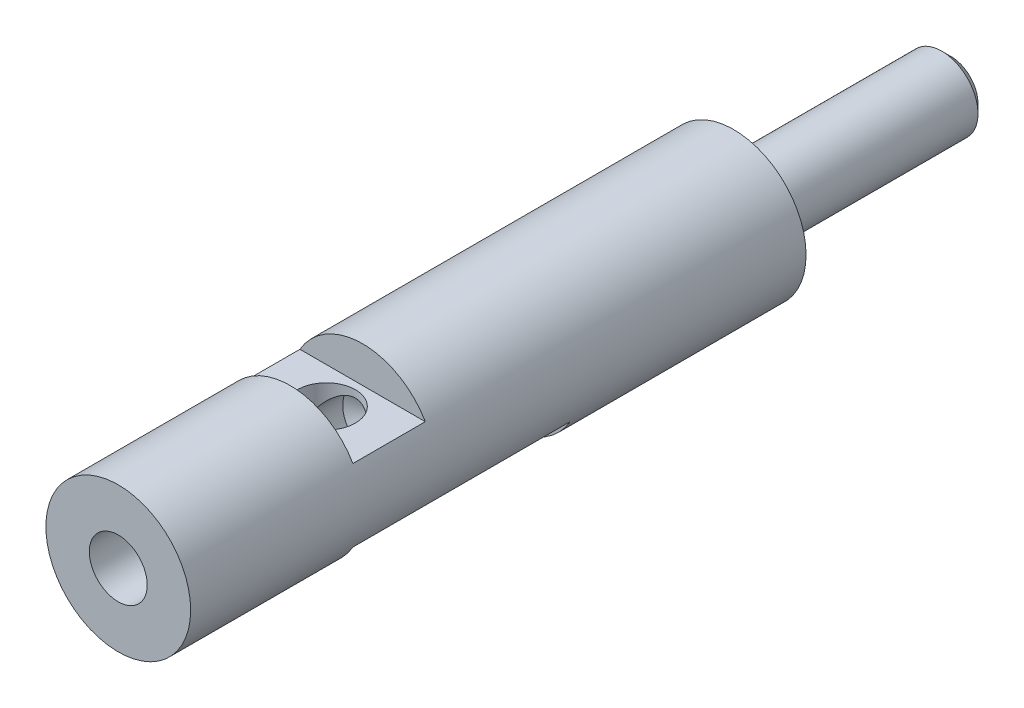
ISO-10303-21;
HEADER;
FILE_DESCRIPTION(('STEP AP214'),'2;1');
FILE_NAME('part.step','',(''),(''),'','','');
FILE_SCHEMA(('AUTOMOTIVE_DESIGN { 1 0 10303 214 1 1 1 1 }'));
ENDSEC;
DATA;
#1=APPLICATION_CONTEXT('core data for automotive mechanical design processes');
#2=APPLICATION_PROTOCOL_DEFINITION('international standard','automotive_design',2000,#1);
#3=PRODUCT_CONTEXT('',#1,'mechanical');
#4=PRODUCT('Part','Part','',(#3));
#5=PRODUCT_RELATED_PRODUCT_CATEGORY('part','',(#4));
#6=PRODUCT_DEFINITION_FORMATION('','',#4);
#7=PRODUCT_DEFINITION_CONTEXT('part definition',#1,'design');
#8=PRODUCT_DEFINITION('design','',#6,#7);
#9=PRODUCT_DEFINITION_SHAPE('','',#8);
#10=(LENGTH_UNIT() NAMED_UNIT(*) SI_UNIT(.MILLI.,.METRE.));
#11=(NAMED_UNIT(*) PLANE_ANGLE_UNIT() SI_UNIT($,.RADIAN.));
#12=(NAMED_UNIT(*) SI_UNIT($,.STERADIAN.) SOLID_ANGLE_UNIT());
#13=UNCERTAINTY_MEASURE_WITH_UNIT(LENGTH_MEASURE(1.E-05),#10,'distance_accuracy_value','');
#14=(GEOMETRIC_REPRESENTATION_CONTEXT(3) GLOBAL_UNCERTAINTY_ASSIGNED_CONTEXT((#13)) GLOBAL_UNIT_ASSIGNED_CONTEXT((#10,
#11,#12)) REPRESENTATION_CONTEXT('',''));
#15=CARTESIAN_POINT('',(0.,0.,0.));
#16=DIRECTION('',(0.,0.,1.));
#17=DIRECTION('',(1.,0.,0.));
#18=AXIS2_PLACEMENT_3D('',#15,#16,#17);
#19=CARTESIAN_POINT('',(-4.,2.,24.5));
#20=DIRECTION('',(0.,-1.,0.));
#21=DIRECTION('',(0.,0.,-1.));
#22=AXIS2_PLACEMENT_3D('',#19,#20,#21);
#23=PLANE('',#22);
#24=DIRECTION('',(1.,0.,0.));
#25=VECTOR('',#24,1.);
#26=CARTESIAN_POINT('',(-4.,2.,24.5));
#27=LINE('',#26,#25);
#28=CARTESIAN_POINT('',(-3.46410161513775,2.,24.5));
#29=VERTEX_POINT('',#28);
#30=CARTESIAN_POINT('',(3.46410161513775,2.,24.5));
#31=VERTEX_POINT('',#30);
#32=EDGE_CURVE('E61',#29,#31,#27,.T.);
#33=ORIENTED_EDGE('',*,*,#32,.T.);
#34=DIRECTION('',(0.,0.,-1.));
#35=VECTOR('',#34,1.);
#36=CARTESIAN_POINT('',(3.46410161513776,2.,34.));
#37=LINE('',#36,#35);
#38=CARTESIAN_POINT('',(3.46410161513776,2.,20.5));
#39=VERTEX_POINT('',#38);
#40=EDGE_CURVE('E148',#39,#31,#37,.F.);
#41=ORIENTED_EDGE('',*,*,#40,.F.);
#42=DIRECTION('',(1.,0.,0.));
#43=VECTOR('',#42,1.);
#44=CARTESIAN_POINT('',(-4.,2.,20.5));
#45=LINE('',#44,#43);
#46=CARTESIAN_POINT('',(-3.46410161513776,2.,20.5));
#47=VERTEX_POINT('',#46);
#48=EDGE_CURVE('E105',#47,#39,#45,.T.);
#49=ORIENTED_EDGE('',*,*,#48,.F.);
#50=DIRECTION('',(0.,0.,-1.));
#51=VECTOR('',#50,1.);
#52=CARTESIAN_POINT('',(-3.46410161513776,2.,34.));
#53=LINE('',#52,#51);
#54=EDGE_CURVE('E151',#29,#47,#53,.T.);
#55=ORIENTED_EDGE('',*,*,#54,.F.);
#56=EDGE_LOOP('',(#33,#41,#49,#55));
#57=FACE_BOUND('',#56,.T.);
#58=CARTESIAN_POINT('',(0.,2.,22.5));
#59=DIRECTION('',(0.,1.,0.));
#60=DIRECTION('',(0.,0.,1.));
#61=AXIS2_PLACEMENT_3D('',#58,#59,#60);
#62=CIRCLE('',#61,1.6);
#63=CARTESIAN_POINT('',(0.,2.,24.1));
#64=VERTEX_POINT('',#63);
#65=EDGE_CURVE('E162',#64,#64,#62,.T.);
#66=ORIENTED_EDGE('',*,*,#65,.F.);
#67=EDGE_LOOP('',(#66));
#68=FACE_BOUND('',#67,.T.);
#69=ADVANCED_FACE('F41',(#57,#68),#23,.F.);
#70=CARTESIAN_POINT('',(0.,0.,34.));
#71=DIRECTION('',(0.,0.,-1.));
#72=DIRECTION('',(-1.,0.,0.));
#73=AXIS2_PLACEMENT_3D('',#70,#71,#72);
#74=CYLINDRICAL_SURFACE('',#73,4.);
#75=ORIENTED_EDGE('',*,*,#54,.T.);
#76=CARTESIAN_POINT('',(0.,0.,20.5));
#77=DIRECTION('',(0.,0.,-1.));
#78=DIRECTION('',(-1.,0.,0.));
#79=AXIS2_PLACEMENT_3D('',#76,#77,#78);
#80=CIRCLE('',#79,4.);
#81=EDGE_CURVE('E90',#47,#39,#80,.T.);
#82=ORIENTED_EDGE('',*,*,#81,.T.);
#83=ORIENTED_EDGE('',*,*,#40,.T.);
#84=CARTESIAN_POINT('',(0.,0.,24.5));
#85=DIRECTION('',(0.,0.,1.));
#86=DIRECTION('',(1.,0.,0.));
#87=AXIS2_PLACEMENT_3D('',#84,#85,#86);
#88=CIRCLE('',#87,4.);
#89=EDGE_CURVE('E145',#31,#29,#88,.T.);
#90=ORIENTED_EDGE('',*,*,#89,.T.);
#91=EDGE_LOOP('',(#75,#82,#83,#90));
#92=FACE_BOUND('',#91,.T.);
#93=DIRECTION('',(0.,0.,-1.));
#94=VECTOR('',#93,1.);
#95=CARTESIAN_POINT('',(-3.46410161513775,-2.,34.));
#96=LINE('',#95,#94);
#97=CARTESIAN_POINT('',(-3.46410161513775,-2.,12.5));
#98=VERTEX_POINT('',#97);
#99=CARTESIAN_POINT('',(-3.46410161513775,-2.,24.5));
#100=VERTEX_POINT('',#99);
#101=EDGE_CURVE('E136',#98,#100,#96,.F.);
#102=ORIENTED_EDGE('',*,*,#101,.T.);
#103=CARTESIAN_POINT('',(0.,0.,24.5));
#104=DIRECTION('',(0.,0.,1.));
#105=DIRECTION('',(1.,0.,0.));
#106=AXIS2_PLACEMENT_3D('',#103,#104,#105);
#107=CIRCLE('',#106,4.);
#108=CARTESIAN_POINT('',(3.46410161513775,-2.,24.5));
#109=VERTEX_POINT('',#108);
#110=EDGE_CURVE('E142',#100,#109,#107,.T.);
#111=ORIENTED_EDGE('',*,*,#110,.T.);
#112=DIRECTION('',(0.,0.,-1.));
#113=VECTOR('',#112,1.);
#114=CARTESIAN_POINT('',(3.46410161513775,-2.,34.));
#115=LINE('',#114,#113);
#116=CARTESIAN_POINT('',(3.46410161513775,-2.,12.5));
#117=VERTEX_POINT('',#116);
#118=EDGE_CURVE('E139',#109,#117,#115,.T.);
#119=ORIENTED_EDGE('',*,*,#118,.T.);
#120=CARTESIAN_POINT('',(0.,0.,12.5));
#121=DIRECTION('',(0.,0.,-1.));
#122=DIRECTION('',(-1.,0.,0.));
#123=AXIS2_PLACEMENT_3D('',#120,#121,#122);
#124=CIRCLE('',#123,4.);
#125=EDGE_CURVE('E133',#117,#98,#124,.T.);
#126=ORIENTED_EDGE('',*,*,#125,.T.);
#127=EDGE_LOOP('',(#102,#111,#119,#126));
#128=FACE_BOUND('',#127,.T.);
#129=CARTESIAN_POINT('',(0.,0.,34.));
#130=DIRECTION('',(0.,0.,1.));
#131=DIRECTION('',(1.,0.,0.));
#132=AXIS2_PLACEMENT_3D('',#129,#130,#131);
#133=CIRCLE('',#132,4.);
#134=CARTESIAN_POINT('',(4.,0.,34.));
#135=VERTEX_POINT('',#134);
#136=EDGE_CURVE('E123',#135,#135,#133,.T.);
#137=ORIENTED_EDGE('',*,*,#136,.F.);
#138=EDGE_LOOP('',(#137));
#139=FACE_BOUND('',#138,.T.);
#140=CARTESIAN_POINT('',(0.,0.,0.));
#141=DIRECTION('',(0.,0.,1.));
#142=DIRECTION('',(1.,0.,0.));
#143=AXIS2_PLACEMENT_3D('',#140,#141,#142);
#144=CIRCLE('',#143,4.);
#145=CARTESIAN_POINT('',(4.,0.,0.));
#146=VERTEX_POINT('',#145);
#147=EDGE_CURVE('E116',#146,#146,#144,.T.);
#148=ORIENTED_EDGE('',*,*,#147,.T.);
#149=EDGE_LOOP('',(#148));
#150=FACE_BOUND('',#149,.T.);
#151=ADVANCED_FACE('F156',(#92,#128,#139,#150),#74,.T.);
#152=CARTESIAN_POINT('',(0.,0.,34.));
#153=DIRECTION('',(0.,0.,1.));
#154=DIRECTION('',(1.,0.,0.));
#155=AXIS2_PLACEMENT_3D('',#152,#153,#154);
#156=PLANE('',#155);
#157=CARTESIAN_POINT('',(0.,0.,34.));
#158=DIRECTION('',(0.,0.,1.));
#159=DIRECTION('',(1.,0.,0.));
#160=AXIS2_PLACEMENT_3D('',#157,#158,#159);
#161=CIRCLE('',#160,1.6);
#162=CARTESIAN_POINT('',(1.6,0.,34.));
#163=VERTEX_POINT('',#162);
#164=EDGE_CURVE('E103',#163,#163,#161,.T.);
#165=ORIENTED_EDGE('',*,*,#164,.F.);
#166=EDGE_LOOP('',(#165));
#167=FACE_BOUND('',#166,.T.);
#168=ORIENTED_EDGE('',*,*,#136,.T.);
#169=EDGE_LOOP('',(#168));
#170=FACE_BOUND('',#169,.T.);
#171=ADVANCED_FACE('F172',(#167,#170),#156,.T.);
#172=CARTESIAN_POINT('',(0.,0.,0.));
#173=DIRECTION('',(0.,0.,1.));
#174=DIRECTION('',(1.,0.,0.));
#175=AXIS2_PLACEMENT_3D('',#172,#173,#174);
#176=PLANE('',#175);
#177=CARTESIAN_POINT('',(0.,0.,0.));
#178=DIRECTION('',(0.,0.,-1.));
#179=DIRECTION('',(-1.,0.,0.));
#180=AXIS2_PLACEMENT_3D('',#177,#178,#179);
#181=CIRCLE('',#180,2.);
#182=CARTESIAN_POINT('',(-2.,0.,0.));
#183=VERTEX_POINT('',#182);
#184=EDGE_CURVE('E119',#183,#183,#181,.T.);
#185=ORIENTED_EDGE('',*,*,#184,.F.);
#186=EDGE_LOOP('',(#185));
#187=FACE_BOUND('',#186,.T.);
#188=ORIENTED_EDGE('',*,*,#147,.F.);
#189=EDGE_LOOP('',(#188));
#190=FACE_BOUND('',#189,.T.);
#191=ADVANCED_FACE('F200',(#187,#190),#176,.F.);
#192=CARTESIAN_POINT('',(0.,0.,-12.));
#193=DIRECTION('',(0.,0.,1.));
#194=DIRECTION('',(1.,0.,0.));
#195=AXIS2_PLACEMENT_3D('',#192,#193,#194);
#196=CYLINDRICAL_SURFACE('',#195,2.);
#197=CARTESIAN_POINT('',(0.,0.,-11.5));
#198=DIRECTION('',(0.,0.,-1.));
#199=DIRECTION('',(-1.,0.,0.));
#200=AXIS2_PLACEMENT_3D('',#197,#198,#199);
#201=CIRCLE('',#200,2.);
#202=CARTESIAN_POINT('',(-2.,0.,-11.5));
#203=VERTEX_POINT('',#202);
#204=EDGE_CURVE('E130',#203,#203,#201,.F.);
#205=ORIENTED_EDGE('',*,*,#204,.T.);
#206=EDGE_LOOP('',(#205));
#207=FACE_BOUND('',#206,.T.);
#208=ORIENTED_EDGE('',*,*,#184,.T.);
#209=EDGE_LOOP('',(#208));
#210=FACE_BOUND('',#209,.T.);
#211=ADVANCED_FACE('F196',(#207,#210),#196,.T.);
#212=CARTESIAN_POINT('',(0.,0.,-12.));
#213=DIRECTION('',(0.,0.,-1.));
#214=DIRECTION('',(-1.,0.,0.));
#215=AXIS2_PLACEMENT_3D('',#212,#213,#214);
#216=PLANE('',#215);
#217=CARTESIAN_POINT('',(0.,0.,-12.));
#218=DIRECTION('',(0.,0.,-1.));
#219=DIRECTION('',(-1.,0.,0.));
#220=AXIS2_PLACEMENT_3D('',#217,#218,#219);
#221=CIRCLE('',#220,1.5);
#222=CARTESIAN_POINT('',(-1.5,0.,-12.));
#223=VERTEX_POINT('',#222);
#224=EDGE_CURVE('E122',#223,#223,#221,.T.);
#225=ORIENTED_EDGE('',*,*,#224,.T.);
#226=EDGE_LOOP('',(#225));
#227=FACE_BOUND('',#226,.T.);
#228=ADVANCED_FACE('F193',(#227),#216,.T.);
#229=CARTESIAN_POINT('',(0.,0.,-12.));
#230=DIRECTION('',(0.,0.,1.));
#231=DIRECTION('',(1.,0.,0.));
#232=AXIS2_PLACEMENT_3D('',#229,#230,#231);
#233=CONICAL_SURFACE('',#232,1.5,0.785398163397441);
#234=ORIENTED_EDGE('',*,*,#204,.F.);
#235=EDGE_LOOP('',(#234));
#236=FACE_BOUND('',#235,.T.);
#237=ORIENTED_EDGE('',*,*,#224,.F.);
#238=EDGE_LOOP('',(#237));
#239=FACE_BOUND('',#238,.T.);
#240=ADVANCED_FACE('F44',(#236,#239),#233,.T.);
#241=CARTESIAN_POINT('',(-4.,-4.,24.5));
#242=DIRECTION('',(0.,0.,1.));
#243=DIRECTION('',(1.,0.,0.));
#244=AXIS2_PLACEMENT_3D('',#241,#242,#243);
#245=PLANE('',#244);
#246=DIRECTION('',(1.,0.,0.));
#247=VECTOR('',#246,1.);
#248=CARTESIAN_POINT('',(-4.,-2.,24.5));
#249=LINE('',#248,#247);
#250=EDGE_CURVE('E113',#100,#109,#249,.T.);
#251=ORIENTED_EDGE('',*,*,#250,.T.);
#252=ORIENTED_EDGE('',*,*,#110,.F.);
#253=EDGE_LOOP('',(#251,#252));
#254=FACE_BOUND('',#253,.T.);
#255=ADVANCED_FACE('F182',(#254),#245,.F.);
#256=CARTESIAN_POINT('',(-4.,-2.,24.5));
#257=DIRECTION('',(0.,1.,0.));
#258=DIRECTION('',(0.,0.,1.));
#259=AXIS2_PLACEMENT_3D('',#256,#257,#258);
#260=PLANE('',#259);
#261=ORIENTED_EDGE('',*,*,#250,.F.);
#262=ORIENTED_EDGE('',*,*,#101,.F.);
#263=DIRECTION('',(1.,0.,0.));
#264=VECTOR('',#263,1.);
#265=CARTESIAN_POINT('',(-4.,-2.,12.5));
#266=LINE('',#265,#264);
#267=EDGE_CURVE('E107',#98,#117,#266,.T.);
#268=ORIENTED_EDGE('',*,*,#267,.T.);
#269=ORIENTED_EDGE('',*,*,#118,.F.);
#270=EDGE_LOOP('',(#261,#262,#268,#269));
#271=FACE_BOUND('',#270,.T.);
#272=ADVANCED_FACE('F185',(#271),#260,.F.);
#273=CARTESIAN_POINT('',(-4.,-2.,12.5));
#274=DIRECTION('',(0.,0.,-1.));
#275=DIRECTION('',(-1.,0.,0.));
#276=AXIS2_PLACEMENT_3D('',#273,#274,#275);
#277=PLANE('',#276);
#278=ORIENTED_EDGE('',*,*,#267,.F.);
#279=ORIENTED_EDGE('',*,*,#125,.F.);
#280=EDGE_LOOP('',(#278,#279));
#281=FACE_BOUND('',#280,.T.);
#282=ADVANCED_FACE('F180',(#281),#277,.F.);
#283=CARTESIAN_POINT('',(0.,0.,20.));
#284=DIRECTION('',(0.,0.,1.));
#285=DIRECTION('',(1.,0.,0.));
#286=AXIS2_PLACEMENT_3D('',#283,#284,#285);
#287=CONICAL_SURFACE('',#286,1.6,1.02974425867665);
#288=CARTESIAN_POINT('',(0.,0.,19.0386230095559));
#289=VERTEX_POINT('',#288);
#290=VERTEX_LOOP('',#289);
#291=FACE_BOUND('',#290,.T.);
#292=CARTESIAN_POINT('',(0.,0.,20.));
#293=DIRECTION('',(0.,0.,1.));
#294=DIRECTION('',(1.,0.,0.));
#295=AXIS2_PLACEMENT_3D('',#292,#293,#294);
#296=CIRCLE('',#295,1.6);
#297=CARTESIAN_POINT('',(1.6,0.,20.));
#298=VERTEX_POINT('',#297);
#299=EDGE_CURVE('E100',#298,#298,#296,.T.);
#300=ORIENTED_EDGE('',*,*,#299,.T.);
#301=EDGE_LOOP('',(#300));
#302=FACE_BOUND('',#301,.T.);
#303=ADVANCED_FACE('F95',(#291,#302),#287,.F.);
#304=CARTESIAN_POINT('',(0.,0.,34.));
#305=DIRECTION('',(0.,0.,1.));
#306=DIRECTION('',(1.,0.,0.));
#307=AXIS2_PLACEMENT_3D('',#304,#305,#306);
#308=CYLINDRICAL_SURFACE('',#307,1.6);
#309=CARTESIAN_POINT('',(0.,0.,22.5));
#310=DIRECTION('',(0.,-0.707106781186548,0.707106781186547));
#311=DIRECTION('',(0.,0.707106781186547,0.707106781186548));
#312=AXIS2_PLACEMENT_3D('',#309,#310,#311);
#313=ELLIPSE('',#312,2.26274169979695,1.6);
#314=CARTESIAN_POINT('',(-1.6,0.,22.5));
#315=VERTEX_POINT('',#314);
#316=CARTESIAN_POINT('',(1.6,0.,22.5));
#317=VERTEX_POINT('',#316);
#318=EDGE_CURVE('E50',#315,#317,#313,.F.);
#319=ORIENTED_EDGE('',*,*,#318,.T.);
#320=CARTESIAN_POINT('',(0.,0.,22.5));
#321=DIRECTION('',(0.,0.707106781186547,0.707106781186548));
#322=DIRECTION('',(0.,-0.707106781186548,0.707106781186547));
#323=AXIS2_PLACEMENT_3D('',#320,#321,#322);
#324=ELLIPSE('',#323,2.26274169979695,1.6);
#325=EDGE_CURVE('E11',#317,#315,#324,.T.);
#326=ORIENTED_EDGE('',*,*,#325,.T.);
#327=EDGE_LOOP('',(#319,#326));
#328=FACE_BOUND('',#327,.T.);
#329=ORIENTED_EDGE('',*,*,#299,.F.);
#330=EDGE_LOOP('',(#329));
#331=FACE_BOUND('',#330,.T.);
#332=ORIENTED_EDGE('',*,*,#164,.T.);
#333=EDGE_LOOP('',(#332));
#334=FACE_BOUND('',#333,.T.);
#335=ADVANCED_FACE('F91',(#328,#331,#334),#308,.F.);
#336=CARTESIAN_POINT('',(-4.,2.,20.5));
#337=DIRECTION('',(0.,0.,-1.));
#338=DIRECTION('',(-1.,0.,0.));
#339=AXIS2_PLACEMENT_3D('',#336,#337,#338);
#340=PLANE('',#339);
#341=ORIENTED_EDGE('',*,*,#48,.T.);
#342=ORIENTED_EDGE('',*,*,#81,.F.);
#343=EDGE_LOOP('',(#341,#342));
#344=FACE_BOUND('',#343,.T.);
#345=ADVANCED_FACE('F94',(#344),#340,.F.);
#346=CARTESIAN_POINT('',(-4.,4.,24.5));
#347=DIRECTION('',(0.,0.,1.));
#348=DIRECTION('',(1.,0.,0.));
#349=AXIS2_PLACEMENT_3D('',#346,#347,#348);
#350=PLANE('',#349);
#351=ORIENTED_EDGE('',*,*,#32,.F.);
#352=ORIENTED_EDGE('',*,*,#89,.F.);
#353=EDGE_LOOP('',(#351,#352));
#354=FACE_BOUND('',#353,.T.);
#355=ADVANCED_FACE('F176',(#354),#350,.F.);
#356=CARTESIAN_POINT('',(0.,2.,22.5));
#357=DIRECTION('',(0.,1.,0.));
#358=DIRECTION('',(0.,0.,1.));
#359=AXIS2_PLACEMENT_3D('',#356,#357,#358);
#360=CYLINDRICAL_SURFACE('',#359,1.6);
#361=ORIENTED_EDGE('',*,*,#318,.F.);
#362=ORIENTED_EDGE('',*,*,#325,.F.);
#363=EDGE_LOOP('',(#361,#362));
#364=FACE_BOUND('',#363,.T.);
#365=ORIENTED_EDGE('',*,*,#65,.T.);
#366=EDGE_LOOP('',(#365));
#367=FACE_BOUND('',#366,.T.);
#368=ADVANCED_FACE('F87',(#364,#367),#360,.F.);
#369=CLOSED_SHELL('',(#69,#151,#171,#191,#211,#228,#240,#255,#272,#282,#303,#335,#345,#355,#368));
#370=MANIFOLD_SOLID_BREP('B2',#369);
#371=ADVANCED_BREP_SHAPE_REPRESENTATION('',(#18,#370),#14);
#372=SHAPE_DEFINITION_REPRESENTATION(#9,#371);
ENDSEC;
END-ISO-10303-21;
